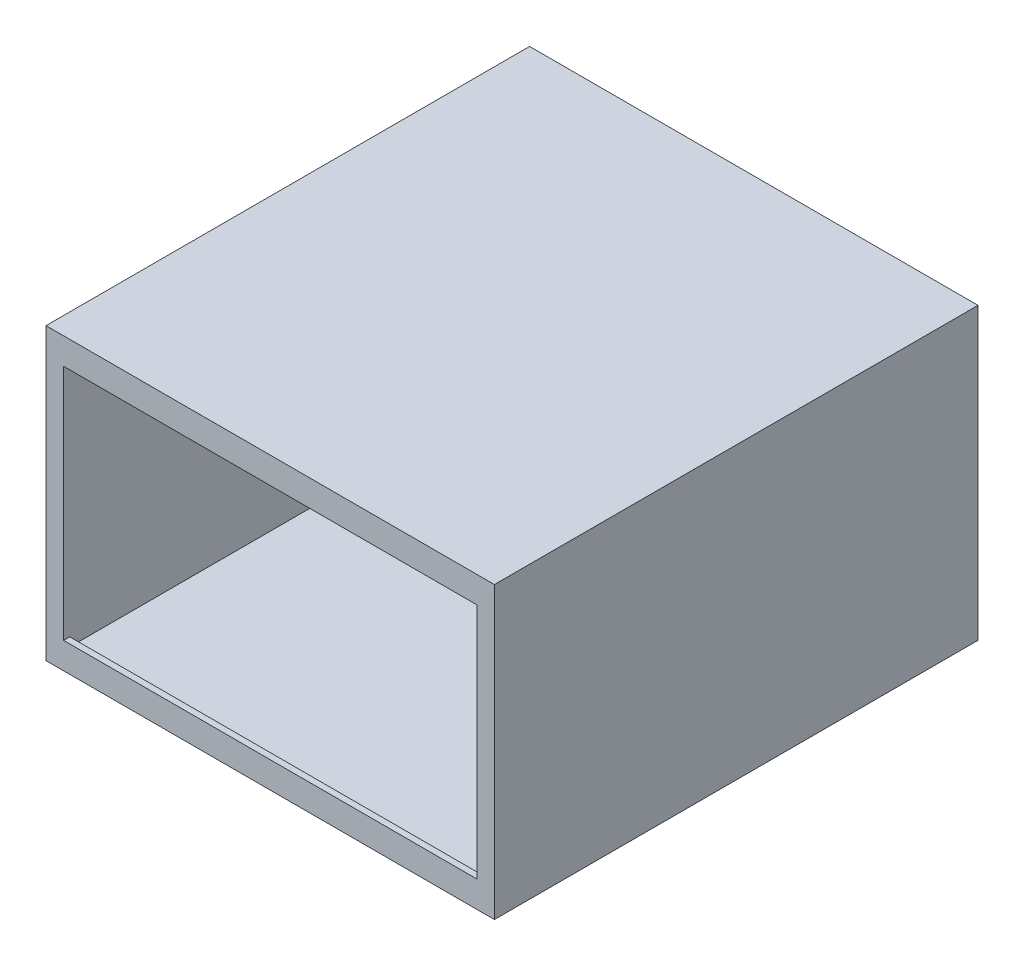
ISO-10303-21;
HEADER;
FILE_DESCRIPTION(('STEP AP214'),'2;1');
FILE_NAME('part.step','',(''),(''),'','','');
FILE_SCHEMA(('AUTOMOTIVE_DESIGN { 1 0 10303 214 1 1 1 1 }'));
ENDSEC;
DATA;
#1=APPLICATION_CONTEXT('core data for automotive mechanical design processes');
#2=APPLICATION_PROTOCOL_DEFINITION('international standard','automotive_design',2000,#1);
#3=PRODUCT_CONTEXT('',#1,'mechanical');
#4=PRODUCT('Part','Part','',(#3));
#5=PRODUCT_RELATED_PRODUCT_CATEGORY('part','',(#4));
#6=PRODUCT_DEFINITION_FORMATION('','',#4);
#7=PRODUCT_DEFINITION_CONTEXT('part definition',#1,'design');
#8=PRODUCT_DEFINITION('design','',#6,#7);
#9=PRODUCT_DEFINITION_SHAPE('','',#8);
#10=(LENGTH_UNIT() NAMED_UNIT(*) SI_UNIT(.MILLI.,.METRE.));
#11=(NAMED_UNIT(*) PLANE_ANGLE_UNIT() SI_UNIT($,.RADIAN.));
#12=(NAMED_UNIT(*) SI_UNIT($,.STERADIAN.) SOLID_ANGLE_UNIT());
#13=UNCERTAINTY_MEASURE_WITH_UNIT(LENGTH_MEASURE(1.E-05),#10,'distance_accuracy_value','');
#14=(GEOMETRIC_REPRESENTATION_CONTEXT(3) GLOBAL_UNCERTAINTY_ASSIGNED_CONTEXT((#13)) GLOBAL_UNIT_ASSIGNED_CONTEXT((#10,
#11,#12)) REPRESENTATION_CONTEXT('',''));
#15=CARTESIAN_POINT('',(0.,0.,0.));
#16=DIRECTION('',(0.,0.,1.));
#17=DIRECTION('',(1.,0.,0.));
#18=AXIS2_PLACEMENT_3D('',#15,#16,#17);
#19=CARTESIAN_POINT('',(0.,-14.5,50.));
#20=DIRECTION('',(0.,1.,0.));
#21=DIRECTION('',(-1.,0.,0.));
#22=AXIS2_PLACEMENT_3D('',#19,#20,#21);
#23=PLANE('',#22);
#24=DIRECTION('',(0.,0.,-1.));
#25=VECTOR('',#24,1.);
#26=CARTESIAN_POINT('',(-23.5,-14.5,50.));
#27=LINE('',#26,#25);
#28=CARTESIAN_POINT('',(-23.5,-14.5,49.3));
#29=VERTEX_POINT('',#28);
#30=CARTESIAN_POINT('',(-23.5,-14.5,0.));
#31=VERTEX_POINT('',#30);
#32=EDGE_CURVE('E211',#29,#31,#27,.T.);
#33=ORIENTED_EDGE('',*,*,#32,.F.);
#34=DIRECTION('',(1.,0.,0.));
#35=VECTOR('',#34,1.);
#36=CARTESIAN_POINT('',(0.,-14.5,49.3));
#37=LINE('',#36,#35);
#38=CARTESIAN_POINT('',(23.5,-14.5,49.3));
#39=VERTEX_POINT('',#38);
#40=EDGE_CURVE('E64',#29,#39,#37,.T.);
#41=ORIENTED_EDGE('',*,*,#40,.T.);
#42=DIRECTION('',(0.,0.,-1.));
#43=VECTOR('',#42,1.);
#44=CARTESIAN_POINT('',(23.5,-14.5,50.));
#45=LINE('',#44,#43);
#46=CARTESIAN_POINT('',(23.5,-14.5,0.));
#47=VERTEX_POINT('',#46);
#48=EDGE_CURVE('E214',#39,#47,#45,.T.);
#49=ORIENTED_EDGE('',*,*,#48,.T.);
#50=DIRECTION('',(1.,0.,0.));
#51=VECTOR('',#50,1.);
#52=CARTESIAN_POINT('',(0.,-14.5,0.));
#53=LINE('',#52,#51);
#54=EDGE_CURVE('E204',#31,#47,#53,.T.);
#55=ORIENTED_EDGE('',*,*,#54,.F.);
#56=EDGE_LOOP('',(#33,#41,#49,#55));
#57=FACE_BOUND('',#56,.T.);
#58=ADVANCED_FACE('F41',(#57),#23,.T.);
#59=CARTESIAN_POINT('',(0.,14.5,50.));
#60=DIRECTION('',(0.,1.,0.));
#61=DIRECTION('',(0.,0.,1.));
#62=AXIS2_PLACEMENT_3D('',#59,#60,#61);
#63=PLANE('',#62);
#64=DIRECTION('',(1.,0.,0.));
#65=VECTOR('',#64,1.);
#66=CARTESIAN_POINT('',(0.,14.5,49.3));
#67=LINE('',#66,#65);
#68=CARTESIAN_POINT('',(-23.5,14.5,49.3));
#69=VERTEX_POINT('',#68);
#70=CARTESIAN_POINT('',(23.5,14.5,49.3));
#71=VERTEX_POINT('',#70);
#72=EDGE_CURVE('E162',#69,#71,#67,.T.);
#73=ORIENTED_EDGE('',*,*,#72,.F.);
#74=DIRECTION('',(0.,0.,-1.));
#75=VECTOR('',#74,1.);
#76=CARTESIAN_POINT('',(-23.5,14.5,50.));
#77=LINE('',#76,#75);
#78=CARTESIAN_POINT('',(-23.5,14.5,0.));
#79=VERTEX_POINT('',#78);
#80=EDGE_CURVE('E209',#69,#79,#77,.T.);
#81=ORIENTED_EDGE('',*,*,#80,.T.);
#82=DIRECTION('',(1.,0.,0.));
#83=VECTOR('',#82,1.);
#84=CARTESIAN_POINT('',(0.,14.5,0.));
#85=LINE('',#84,#83);
#86=CARTESIAN_POINT('',(23.5,14.5,0.));
#87=VERTEX_POINT('',#86);
#88=EDGE_CURVE('E184',#79,#87,#85,.T.);
#89=ORIENTED_EDGE('',*,*,#88,.T.);
#90=DIRECTION('',(0.,0.,-1.));
#91=VECTOR('',#90,1.);
#92=CARTESIAN_POINT('',(23.5,14.5,50.));
#93=LINE('',#92,#91);
#94=EDGE_CURVE('E216',#71,#87,#93,.T.);
#95=ORIENTED_EDGE('',*,*,#94,.F.);
#96=EDGE_LOOP('',(#73,#81,#89,#95));
#97=FACE_BOUND('',#96,.T.);
#98=ADVANCED_FACE('F256',(#97),#63,.F.);
#99=CARTESIAN_POINT('',(23.5,0.,50.));
#100=DIRECTION('',(1.,0.,0.));
#101=DIRECTION('',(0.,0.,-1.));
#102=AXIS2_PLACEMENT_3D('',#99,#100,#101);
#103=PLANE('',#102);
#104=DIRECTION('',(0.,-1.,0.));
#105=VECTOR('',#104,1.);
#106=CARTESIAN_POINT('',(23.5,0.,49.3));
#107=LINE('',#106,#105);
#108=CARTESIAN_POINT('',(23.5,-13.5,49.3));
#109=VERTEX_POINT('',#108);
#110=EDGE_CURVE('E56',#109,#39,#107,.T.);
#111=ORIENTED_EDGE('',*,*,#110,.F.);
#112=DIRECTION('',(0.,0.,1.));
#113=VECTOR('',#112,1.);
#114=CARTESIAN_POINT('',(23.5,-13.5,50.));
#115=LINE('',#114,#113);
#116=CARTESIAN_POINT('',(23.5,-13.5,50.));
#117=VERTEX_POINT('',#116);
#118=EDGE_CURVE('E357',#109,#117,#115,.T.);
#119=ORIENTED_EDGE('',*,*,#118,.T.);
#120=DIRECTION('',(0.,-1.,0.));
#121=VECTOR('',#120,1.);
#122=CARTESIAN_POINT('',(23.5,0.,50.));
#123=LINE('',#122,#121);
#124=CARTESIAN_POINT('',(23.5,13.5,50.));
#125=VERTEX_POINT('',#124);
#126=EDGE_CURVE('E142',#125,#117,#123,.T.);
#127=ORIENTED_EDGE('',*,*,#126,.F.);
#128=DIRECTION('',(0.,0.,-1.));
#129=VECTOR('',#128,1.);
#130=CARTESIAN_POINT('',(23.5,13.5,50.));
#131=LINE('',#130,#129);
#132=CARTESIAN_POINT('',(23.5,13.5,49.3));
#133=VERTEX_POINT('',#132);
#134=EDGE_CURVE('E152',#125,#133,#131,.T.);
#135=ORIENTED_EDGE('',*,*,#134,.T.);
#136=DIRECTION('',(0.,-1.,0.));
#137=VECTOR('',#136,1.);
#138=CARTESIAN_POINT('',(23.5,0.,49.3));
#139=LINE('',#138,#137);
#140=EDGE_CURVE('E165',#71,#133,#139,.T.);
#141=ORIENTED_EDGE('',*,*,#140,.F.);
#142=ORIENTED_EDGE('',*,*,#94,.T.);
#143=DIRECTION('',(0.,-1.,0.));
#144=VECTOR('',#143,1.);
#145=CARTESIAN_POINT('',(23.5,0.,0.));
#146=LINE('',#145,#144);
#147=EDGE_CURVE('E201',#87,#47,#146,.T.);
#148=ORIENTED_EDGE('',*,*,#147,.T.);
#149=ORIENTED_EDGE('',*,*,#48,.F.);
#150=EDGE_LOOP('',(#111,#119,#127,#135,#141,#142,#148,#149));
#151=FACE_BOUND('',#150,.T.);
#152=ADVANCED_FACE('F262',(#151),#103,.F.);
#153=CARTESIAN_POINT('',(25.5,0.,50.));
#154=DIRECTION('',(1.,0.,0.));
#155=DIRECTION('',(0.,0.,-1.));
#156=AXIS2_PLACEMENT_3D('',#153,#154,#155);
#157=PLANE('',#156);
#158=DIRECTION('',(0.,-1.,0.));
#159=VECTOR('',#158,1.);
#160=CARTESIAN_POINT('',(25.5,0.,50.));
#161=LINE('',#160,#159);
#162=CARTESIAN_POINT('',(25.5,16.5,50.));
#163=VERTEX_POINT('',#162);
#164=CARTESIAN_POINT('',(25.5,-16.5,50.));
#165=VERTEX_POINT('',#164);
#166=EDGE_CURVE('E187',#163,#165,#161,.T.);
#167=ORIENTED_EDGE('',*,*,#166,.T.);
#168=DIRECTION('',(0.,0.,-1.));
#169=VECTOR('',#168,1.);
#170=CARTESIAN_POINT('',(25.5,-16.5,50.));
#171=LINE('',#170,#169);
#172=CARTESIAN_POINT('',(25.5,-16.5,-5.));
#173=VERTEX_POINT('',#172);
#174=EDGE_CURVE('E141',#165,#173,#171,.T.);
#175=ORIENTED_EDGE('',*,*,#174,.T.);
#176=DIRECTION('',(0.,-1.,0.));
#177=VECTOR('',#176,1.);
#178=CARTESIAN_POINT('',(25.5,0.,-5.));
#179=LINE('',#178,#177);
#180=CARTESIAN_POINT('',(25.5,16.5,-5.));
#181=VERTEX_POINT('',#180);
#182=EDGE_CURVE('E172',#181,#173,#179,.T.);
#183=ORIENTED_EDGE('',*,*,#182,.F.);
#184=DIRECTION('',(0.,0.,-1.));
#185=VECTOR('',#184,1.);
#186=CARTESIAN_POINT('',(25.5,16.5,50.));
#187=LINE('',#186,#185);
#188=EDGE_CURVE('E212',#163,#181,#187,.T.);
#189=ORIENTED_EDGE('',*,*,#188,.F.);
#190=EDGE_LOOP('',(#167,#175,#183,#189));
#191=FACE_BOUND('',#190,.T.);
#192=ADVANCED_FACE('F43',(#191),#157,.T.);
#193=CARTESIAN_POINT('',(0.,16.5,50.));
#194=DIRECTION('',(0.,1.,0.));
#195=DIRECTION('',(0.,0.,1.));
#196=AXIS2_PLACEMENT_3D('',#193,#194,#195);
#197=PLANE('',#196);
#198=ORIENTED_EDGE('',*,*,#188,.T.);
#199=DIRECTION('',(1.,0.,0.));
#200=VECTOR('',#199,1.);
#201=CARTESIAN_POINT('',(0.,16.5,-5.));
#202=LINE('',#201,#200);
#203=CARTESIAN_POINT('',(-25.5,16.5,-5.));
#204=VERTEX_POINT('',#203);
#205=EDGE_CURVE('E175',#204,#181,#202,.T.);
#206=ORIENTED_EDGE('',*,*,#205,.F.);
#207=DIRECTION('',(0.,0.,-1.));
#208=VECTOR('',#207,1.);
#209=CARTESIAN_POINT('',(-25.5,16.5,50.));
#210=LINE('',#209,#208);
#211=CARTESIAN_POINT('',(-25.5,16.5,50.));
#212=VERTEX_POINT('',#211);
#213=EDGE_CURVE('E221',#212,#204,#210,.T.);
#214=ORIENTED_EDGE('',*,*,#213,.F.);
#215=DIRECTION('',(1.,0.,0.));
#216=VECTOR('',#215,1.);
#217=CARTESIAN_POINT('',(0.,16.5,50.));
#218=LINE('',#217,#216);
#219=EDGE_CURVE('E189',#212,#163,#218,.T.);
#220=ORIENTED_EDGE('',*,*,#219,.T.);
#221=EDGE_LOOP('',(#198,#206,#214,#220));
#222=FACE_BOUND('',#221,.T.);
#223=ADVANCED_FACE('F225',(#222),#197,.T.);
#224=CARTESIAN_POINT('',(-25.5,0.,50.));
#225=DIRECTION('',(1.,0.,0.));
#226=DIRECTION('',(0.,0.,-1.));
#227=AXIS2_PLACEMENT_3D('',#224,#225,#226);
#228=PLANE('',#227);
#229=DIRECTION('',(0.,0.,-1.));
#230=VECTOR('',#229,1.);
#231=CARTESIAN_POINT('',(-25.5,-16.5,50.));
#232=LINE('',#231,#230);
#233=CARTESIAN_POINT('',(-25.5,-16.5,50.));
#234=VERTEX_POINT('',#233);
#235=CARTESIAN_POINT('',(-25.5,-16.5,-5.));
#236=VERTEX_POINT('',#235);
#237=EDGE_CURVE('E219',#234,#236,#232,.T.);
#238=ORIENTED_EDGE('',*,*,#237,.F.);
#239=DIRECTION('',(0.,-1.,0.));
#240=VECTOR('',#239,1.);
#241=CARTESIAN_POINT('',(-25.5,0.,50.));
#242=LINE('',#241,#240);
#243=EDGE_CURVE('E193',#212,#234,#242,.T.);
#244=ORIENTED_EDGE('',*,*,#243,.F.);
#245=ORIENTED_EDGE('',*,*,#213,.T.);
#246=DIRECTION('',(0.,-1.,0.));
#247=VECTOR('',#246,1.);
#248=CARTESIAN_POINT('',(-25.5,0.,-5.));
#249=LINE('',#248,#247);
#250=EDGE_CURVE('E178',#204,#236,#249,.T.);
#251=ORIENTED_EDGE('',*,*,#250,.T.);
#252=EDGE_LOOP('',(#238,#244,#245,#251));
#253=FACE_BOUND('',#252,.T.);
#254=ADVANCED_FACE('F241',(#253),#228,.F.);
#255=CARTESIAN_POINT('',(0.,-16.5,50.));
#256=DIRECTION('',(0.,1.,0.));
#257=DIRECTION('',(0.,0.,1.));
#258=AXIS2_PLACEMENT_3D('',#255,#256,#257);
#259=PLANE('',#258);
#260=ORIENTED_EDGE('',*,*,#237,.T.);
#261=DIRECTION('',(1.,0.,0.));
#262=VECTOR('',#261,1.);
#263=CARTESIAN_POINT('',(0.,-16.5,-5.));
#264=LINE('',#263,#262);
#265=EDGE_CURVE('E181',#236,#173,#264,.T.);
#266=ORIENTED_EDGE('',*,*,#265,.T.);
#267=ORIENTED_EDGE('',*,*,#174,.F.);
#268=DIRECTION('',(1.,0.,0.));
#269=VECTOR('',#268,1.);
#270=CARTESIAN_POINT('',(0.,-16.5,50.));
#271=LINE('',#270,#269);
#272=EDGE_CURVE('E195',#234,#165,#271,.T.);
#273=ORIENTED_EDGE('',*,*,#272,.F.);
#274=EDGE_LOOP('',(#260,#266,#267,#273));
#275=FACE_BOUND('',#274,.T.);
#276=ADVANCED_FACE('F237',(#275),#259,.F.);
#277=CARTESIAN_POINT('',(-23.5,0.,50.));
#278=DIRECTION('',(1.,0.,0.));
#279=DIRECTION('',(0.,1.,0.));
#280=AXIS2_PLACEMENT_3D('',#277,#278,#279);
#281=PLANE('',#280);
#282=DIRECTION('',(0.,0.,1.));
#283=VECTOR('',#282,1.);
#284=CARTESIAN_POINT('',(-23.5,-13.5,50.));
#285=LINE('',#284,#283);
#286=CARTESIAN_POINT('',(-23.5,-13.5,49.3));
#287=VERTEX_POINT('',#286);
#288=CARTESIAN_POINT('',(-23.5,-13.5,50.));
#289=VERTEX_POINT('',#288);
#290=EDGE_CURVE('E359',#287,#289,#285,.T.);
#291=ORIENTED_EDGE('',*,*,#290,.F.);
#292=DIRECTION('',(0.,-1.,0.));
#293=VECTOR('',#292,1.);
#294=CARTESIAN_POINT('',(-23.5,0.,49.3));
#295=LINE('',#294,#293);
#296=EDGE_CURVE('E11',#287,#29,#295,.T.);
#297=ORIENTED_EDGE('',*,*,#296,.T.);
#298=ORIENTED_EDGE('',*,*,#32,.T.);
#299=DIRECTION('',(0.,-1.,0.));
#300=VECTOR('',#299,1.);
#301=CARTESIAN_POINT('',(-23.5,0.,0.));
#302=LINE('',#301,#300);
#303=EDGE_CURVE('E190',#79,#31,#302,.T.);
#304=ORIENTED_EDGE('',*,*,#303,.F.);
#305=ORIENTED_EDGE('',*,*,#80,.F.);
#306=DIRECTION('',(0.,-1.,0.));
#307=VECTOR('',#306,1.);
#308=CARTESIAN_POINT('',(-23.5,0.,49.3));
#309=LINE('',#308,#307);
#310=CARTESIAN_POINT('',(-23.5,13.5,49.3));
#311=VERTEX_POINT('',#310);
#312=EDGE_CURVE('E49',#69,#311,#309,.T.);
#313=ORIENTED_EDGE('',*,*,#312,.T.);
#314=DIRECTION('',(0.,0.,-1.));
#315=VECTOR('',#314,1.);
#316=CARTESIAN_POINT('',(-23.5,13.5,50.));
#317=LINE('',#316,#315);
#318=CARTESIAN_POINT('',(-23.5,13.5,50.));
#319=VERTEX_POINT('',#318);
#320=EDGE_CURVE('E145',#319,#311,#317,.T.);
#321=ORIENTED_EDGE('',*,*,#320,.F.);
#322=DIRECTION('',(0.,-1.,0.));
#323=VECTOR('',#322,1.);
#324=CARTESIAN_POINT('',(-23.5,0.,50.));
#325=LINE('',#324,#323);
#326=EDGE_CURVE('E130',#319,#289,#325,.T.);
#327=ORIENTED_EDGE('',*,*,#326,.T.);
#328=EDGE_LOOP('',(#291,#297,#298,#304,#305,#313,#321,#327));
#329=FACE_BOUND('',#328,.T.);
#330=ADVANCED_FACE('F146',(#329),#281,.T.);
#331=CARTESIAN_POINT('',(0.,0.,50.));
#332=DIRECTION('',(0.,0.,1.));
#333=DIRECTION('',(1.,0.,0.));
#334=AXIS2_PLACEMENT_3D('',#331,#332,#333);
#335=PLANE('',#334);
#336=ORIENTED_EDGE('',*,*,#126,.T.);
#337=DIRECTION('',(-1.,0.,0.));
#338=VECTOR('',#337,1.);
#339=CARTESIAN_POINT('',(25.5,-13.5,50.));
#340=LINE('',#339,#338);
#341=EDGE_CURVE('E138',#117,#289,#340,.T.);
#342=ORIENTED_EDGE('',*,*,#341,.T.);
#343=ORIENTED_EDGE('',*,*,#326,.F.);
#344=DIRECTION('',(1.,0.,0.));
#345=VECTOR('',#344,1.);
#346=CARTESIAN_POINT('',(-25.5,13.5,50.));
#347=LINE('',#346,#345);
#348=EDGE_CURVE('E136',#319,#125,#347,.T.);
#349=ORIENTED_EDGE('',*,*,#348,.T.);
#350=EDGE_LOOP('',(#336,#342,#343,#349));
#351=FACE_BOUND('',#350,.T.);
#352=ORIENTED_EDGE('',*,*,#272,.T.);
#353=ORIENTED_EDGE('',*,*,#166,.F.);
#354=ORIENTED_EDGE('',*,*,#219,.F.);
#355=ORIENTED_EDGE('',*,*,#243,.T.);
#356=EDGE_LOOP('',(#352,#353,#354,#355));
#357=FACE_BOUND('',#356,.T.);
#358=ADVANCED_FACE('F133',(#351,#357),#335,.T.);
#359=CARTESIAN_POINT('',(0.,0.,0.));
#360=DIRECTION('',(0.,0.,1.));
#361=DIRECTION('',(1.,0.,0.));
#362=AXIS2_PLACEMENT_3D('',#359,#360,#361);
#363=PLANE('',#362);
#364=CARTESIAN_POINT('',(0.,0.,0.));
#365=DIRECTION('',(0.,0.,1.));
#366=DIRECTION('',(1.,0.,0.));
#367=AXIS2_PLACEMENT_3D('',#364,#365,#366);
#368=CIRCLE('',#367,4.5);
#369=CARTESIAN_POINT('',(4.5,0.,0.));
#370=VERTEX_POINT('',#369);
#371=EDGE_CURVE('E168',#370,#370,#368,.T.);
#372=ORIENTED_EDGE('',*,*,#371,.F.);
#373=EDGE_LOOP('',(#372));
#374=FACE_BOUND('',#373,.T.);
#375=ORIENTED_EDGE('',*,*,#88,.F.);
#376=ORIENTED_EDGE('',*,*,#303,.T.);
#377=ORIENTED_EDGE('',*,*,#54,.T.);
#378=ORIENTED_EDGE('',*,*,#147,.F.);
#379=EDGE_LOOP('',(#375,#376,#377,#378));
#380=FACE_BOUND('',#379,.T.);
#381=ADVANCED_FACE('F243',(#374,#380),#363,.T.);
#382=CARTESIAN_POINT('',(0.,0.,-5.));
#383=DIRECTION('',(0.,0.,1.));
#384=DIRECTION('',(1.,0.,0.));
#385=AXIS2_PLACEMENT_3D('',#382,#383,#384);
#386=CYLINDRICAL_SURFACE('',#385,4.5);
#387=CARTESIAN_POINT('',(0.,0.,-5.));
#388=DIRECTION('',(0.,0.,1.));
#389=DIRECTION('',(1.,0.,0.));
#390=AXIS2_PLACEMENT_3D('',#387,#388,#389);
#391=CIRCLE('',#390,4.5);
#392=CARTESIAN_POINT('',(4.5,0.,-5.));
#393=VERTEX_POINT('',#392);
#394=EDGE_CURVE('E169',#393,#393,#391,.T.);
#395=ORIENTED_EDGE('',*,*,#394,.F.);
#396=EDGE_LOOP('',(#395));
#397=FACE_BOUND('',#396,.T.);
#398=ORIENTED_EDGE('',*,*,#371,.T.);
#399=EDGE_LOOP('',(#398));
#400=FACE_BOUND('',#399,.T.);
#401=ADVANCED_FACE('F250',(#397,#400),#386,.F.);
#402=CARTESIAN_POINT('',(0.,0.,-5.));
#403=DIRECTION('',(0.,0.,1.));
#404=DIRECTION('',(1.,0.,0.));
#405=AXIS2_PLACEMENT_3D('',#402,#403,#404);
#406=PLANE('',#405);
#407=ORIENTED_EDGE('',*,*,#394,.T.);
#408=EDGE_LOOP('',(#407));
#409=FACE_BOUND('',#408,.T.);
#410=ORIENTED_EDGE('',*,*,#182,.T.);
#411=ORIENTED_EDGE('',*,*,#265,.F.);
#412=ORIENTED_EDGE('',*,*,#250,.F.);
#413=ORIENTED_EDGE('',*,*,#205,.T.);
#414=EDGE_LOOP('',(#410,#411,#412,#413));
#415=FACE_BOUND('',#414,.T.);
#416=ADVANCED_FACE('F232',(#409,#415),#406,.F.);
#417=CARTESIAN_POINT('',(0.,0.,49.3));
#418=DIRECTION('',(0.,0.,1.));
#419=DIRECTION('',(1.,0.,0.));
#420=AXIS2_PLACEMENT_3D('',#417,#418,#419);
#421=PLANE('',#420);
#422=ORIENTED_EDGE('',*,*,#72,.T.);
#423=ORIENTED_EDGE('',*,*,#140,.T.);
#424=DIRECTION('',(1.,0.,0.));
#425=VECTOR('',#424,1.);
#426=CARTESIAN_POINT('',(-25.5,13.5,49.3));
#427=LINE('',#426,#425);
#428=EDGE_CURVE('E153',#311,#133,#427,.T.);
#429=ORIENTED_EDGE('',*,*,#428,.F.);
#430=ORIENTED_EDGE('',*,*,#312,.F.);
#431=EDGE_LOOP('',(#422,#423,#429,#430));
#432=FACE_BOUND('',#431,.T.);
#433=ADVANCED_FACE('F303',(#432),#421,.F.);
#434=CARTESIAN_POINT('',(-25.5,13.5,49.3));
#435=DIRECTION('',(0.,-1.,0.));
#436=DIRECTION('',(0.,0.,-1.));
#437=AXIS2_PLACEMENT_3D('',#434,#435,#436);
#438=PLANE('',#437);
#439=ORIENTED_EDGE('',*,*,#134,.F.);
#440=ORIENTED_EDGE('',*,*,#348,.F.);
#441=ORIENTED_EDGE('',*,*,#320,.T.);
#442=ORIENTED_EDGE('',*,*,#428,.T.);
#443=EDGE_LOOP('',(#439,#440,#441,#442));
#444=FACE_BOUND('',#443,.T.);
#445=ADVANCED_FACE('F156',(#444),#438,.T.);
#446=CARTESIAN_POINT('',(0.,0.,49.3));
#447=DIRECTION('',(0.,0.,1.));
#448=DIRECTION('',(1.,0.,0.));
#449=AXIS2_PLACEMENT_3D('',#446,#447,#448);
#450=PLANE('',#449);
#451=DIRECTION('',(-1.,0.,0.));
#452=VECTOR('',#451,1.);
#453=CARTESIAN_POINT('',(25.5,-13.5,49.3));
#454=LINE('',#453,#452);
#455=EDGE_CURVE('E363',#109,#287,#454,.T.);
#456=ORIENTED_EDGE('',*,*,#455,.F.);
#457=ORIENTED_EDGE('',*,*,#110,.T.);
#458=ORIENTED_EDGE('',*,*,#40,.F.);
#459=ORIENTED_EDGE('',*,*,#296,.F.);
#460=EDGE_LOOP('',(#456,#457,#458,#459));
#461=FACE_BOUND('',#460,.T.);
#462=ADVANCED_FACE('F315',(#461),#450,.F.);
#463=CARTESIAN_POINT('',(25.5,-13.5,49.3));
#464=DIRECTION('',(0.,1.,0.));
#465=DIRECTION('',(0.,0.,1.));
#466=AXIS2_PLACEMENT_3D('',#463,#464,#465);
#467=PLANE('',#466);
#468=ORIENTED_EDGE('',*,*,#118,.F.);
#469=ORIENTED_EDGE('',*,*,#455,.T.);
#470=ORIENTED_EDGE('',*,*,#290,.T.);
#471=ORIENTED_EDGE('',*,*,#341,.F.);
#472=EDGE_LOOP('',(#468,#469,#470,#471));
#473=FACE_BOUND('',#472,.T.);
#474=ADVANCED_FACE('F323',(#473),#467,.T.);
#475=CLOSED_SHELL('',(#58,#98,#152,#192,#223,#254,#276,#330,#358,#381,#401,#416,#433,#445,#462,#474));
#476=MANIFOLD_SOLID_BREP('B2',#475);
#477=ADVANCED_BREP_SHAPE_REPRESENTATION('',(#18,#476),#14);
#478=SHAPE_DEFINITION_REPRESENTATION(#9,#477);
ENDSEC;
END-ISO-10303-21;
